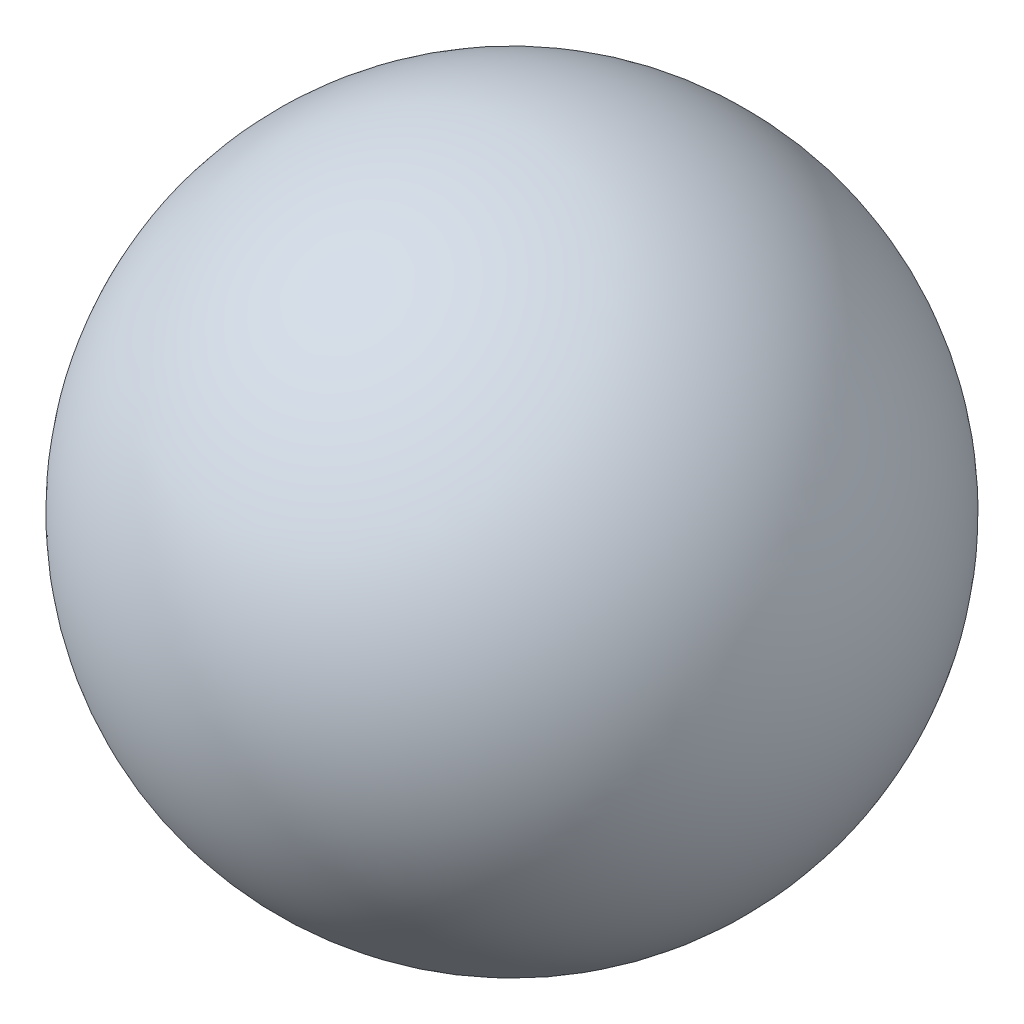
ISO-10303-21;
HEADER;
FILE_DESCRIPTION(('STEP AP214'),'2;1');
FILE_NAME('part.step','',(''),(''),'','','');
FILE_SCHEMA(('AUTOMOTIVE_DESIGN { 1 0 10303 214 1 1 1 1 }'));
ENDSEC;
DATA;
#1=APPLICATION_CONTEXT('core data for automotive mechanical design processes');
#2=APPLICATION_PROTOCOL_DEFINITION('international standard','automotive_design',2000,#1);
#3=PRODUCT_CONTEXT('',#1,'mechanical');
#4=PRODUCT('Part','Part','',(#3));
#5=PRODUCT_RELATED_PRODUCT_CATEGORY('part','',(#4));
#6=PRODUCT_DEFINITION_FORMATION('','',#4);
#7=PRODUCT_DEFINITION_CONTEXT('part definition',#1,'design');
#8=PRODUCT_DEFINITION('design','',#6,#7);
#9=PRODUCT_DEFINITION_SHAPE('','',#8);
#10=(LENGTH_UNIT() NAMED_UNIT(*) SI_UNIT(.MILLI.,.METRE.));
#11=(NAMED_UNIT(*) PLANE_ANGLE_UNIT() SI_UNIT($,.RADIAN.));
#12=(NAMED_UNIT(*) SI_UNIT($,.STERADIAN.) SOLID_ANGLE_UNIT());
#13=UNCERTAINTY_MEASURE_WITH_UNIT(LENGTH_MEASURE(1.E-05),#10,'distance_accuracy_value','');
#14=(GEOMETRIC_REPRESENTATION_CONTEXT(3) GLOBAL_UNCERTAINTY_ASSIGNED_CONTEXT((#13)) GLOBAL_UNIT_ASSIGNED_CONTEXT((#10,
#11,#12)) REPRESENTATION_CONTEXT('',''));
#15=CARTESIAN_POINT('',(0.,0.,0.));
#16=DIRECTION('',(0.,0.,1.));
#17=DIRECTION('',(1.,0.,0.));
#18=AXIS2_PLACEMENT_3D('',#15,#16,#17);
#19=CARTESIAN_POINT('',(0.,0.,0.));
#20=DIRECTION('',(-1.,0.,0.));
#21=DIRECTION('',(0.,1.,0.));
#22=AXIS2_PLACEMENT_3D('',#19,#20,#21);
#23=SPHERICAL_SURFACE('',#22,4.745);
#24=CARTESIAN_POINT('',(-4.745,0.,0.));
#25=VERTEX_POINT('',#24);
#26=VERTEX_LOOP('',#25);
#27=FACE_BOUND('',#26,.T.);
#28=ADVANCED_FACE('F31',(#27),#23,.T.);
#29=CLOSED_SHELL('',(#28));
#30=MANIFOLD_SOLID_BREP('B2',#29);
#31=ADVANCED_BREP_SHAPE_REPRESENTATION('',(#18,#30),#14);
#32=SHAPE_DEFINITION_REPRESENTATION(#9,#31);
ENDSEC;
END-ISO-10303-21;
